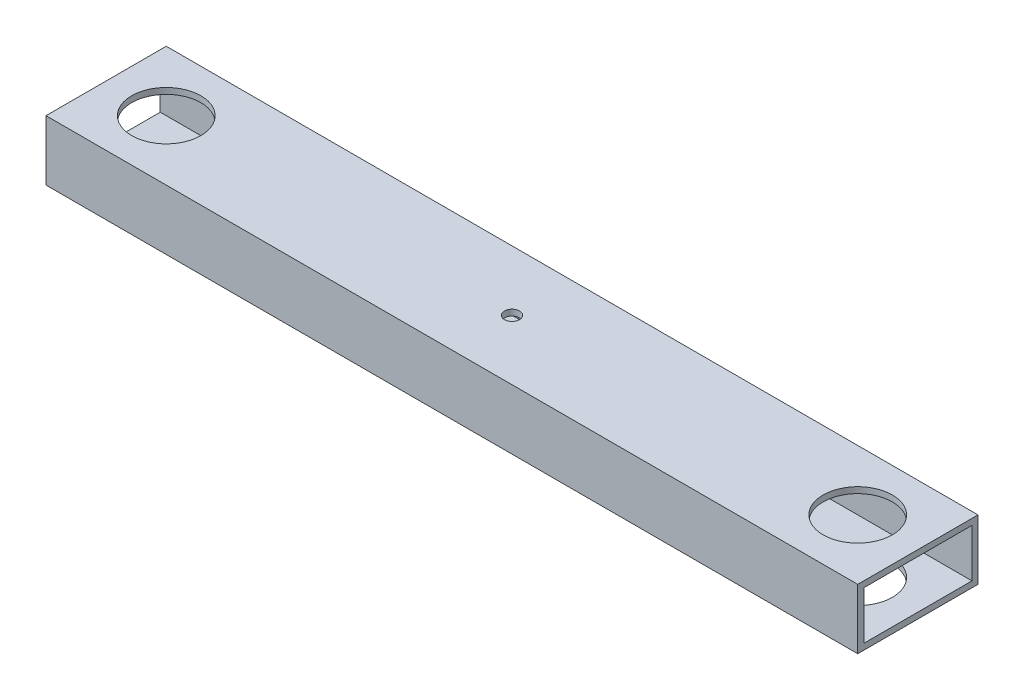
ISO-10303-21;
HEADER;
FILE_DESCRIPTION(('STEP AP214'),'2;1');
FILE_NAME('part.step','',(''),(''),'','','');
FILE_SCHEMA(('AUTOMOTIVE_DESIGN { 1 0 10303 214 1 1 1 1 }'));
ENDSEC;
DATA;
#1=APPLICATION_CONTEXT('core data for automotive mechanical design processes');
#2=APPLICATION_PROTOCOL_DEFINITION('international standard','automotive_design',2000,#1);
#3=PRODUCT_CONTEXT('',#1,'mechanical');
#4=PRODUCT('Part','Part','',(#3));
#5=PRODUCT_RELATED_PRODUCT_CATEGORY('part','',(#4));
#6=PRODUCT_DEFINITION_FORMATION('','',#4);
#7=PRODUCT_DEFINITION_CONTEXT('part definition',#1,'design');
#8=PRODUCT_DEFINITION('design','',#6,#7);
#9=PRODUCT_DEFINITION_SHAPE('','',#8);
#10=(LENGTH_UNIT() NAMED_UNIT(*) SI_UNIT(.MILLI.,.METRE.));
#11=(NAMED_UNIT(*) PLANE_ANGLE_UNIT() SI_UNIT($,.RADIAN.));
#12=(NAMED_UNIT(*) SI_UNIT($,.STERADIAN.) SOLID_ANGLE_UNIT());
#13=UNCERTAINTY_MEASURE_WITH_UNIT(LENGTH_MEASURE(1.E-05),#10,'distance_accuracy_value','');
#14=(GEOMETRIC_REPRESENTATION_CONTEXT(3) GLOBAL_UNCERTAINTY_ASSIGNED_CONTEXT((#13)) GLOBAL_UNIT_ASSIGNED_CONTEXT((#10,
#11,#12)) REPRESENTATION_CONTEXT('',''));
#15=CARTESIAN_POINT('',(0.,0.,0.));
#16=DIRECTION('',(0.,0.,1.));
#17=DIRECTION('',(1.,0.,0.));
#18=AXIS2_PLACEMENT_3D('',#15,#16,#17);
#19=CARTESIAN_POINT('',(342.9,0.,0.));
#20=DIRECTION('',(-1.,0.,0.));
#21=DIRECTION('',(0.,0.,1.));
#22=AXIS2_PLACEMENT_3D('',#19,#20,#21);
#23=PLANE('',#22);
#24=DIRECTION('',(0.,1.,0.));
#25=VECTOR('',#24,1.);
#26=CARTESIAN_POINT('',(342.9,-12.7,-25.4));
#27=LINE('',#26,#25);
#28=CARTESIAN_POINT('',(342.9,-12.7,-25.4));
#29=VERTEX_POINT('',#28);
#30=CARTESIAN_POINT('',(342.9,12.7,-25.4));
#31=VERTEX_POINT('',#30);
#32=EDGE_CURVE('E146',#29,#31,#27,.T.);
#33=ORIENTED_EDGE('',*,*,#32,.T.);
#34=DIRECTION('',(0.,0.,1.));
#35=VECTOR('',#34,1.);
#36=CARTESIAN_POINT('',(342.9,12.7,25.4));
#37=LINE('',#36,#35);
#38=CARTESIAN_POINT('',(342.9,12.7,25.4));
#39=VERTEX_POINT('',#38);
#40=EDGE_CURVE('E149',#31,#39,#37,.T.);
#41=ORIENTED_EDGE('',*,*,#40,.T.);
#42=DIRECTION('',(0.,-1.,0.));
#43=VECTOR('',#42,1.);
#44=CARTESIAN_POINT('',(342.9,-12.7,25.4));
#45=LINE('',#44,#43);
#46=CARTESIAN_POINT('',(342.9,-12.7,25.4));
#47=VERTEX_POINT('',#46);
#48=EDGE_CURVE('E152',#39,#47,#45,.T.);
#49=ORIENTED_EDGE('',*,*,#48,.T.);
#50=DIRECTION('',(0.,0.,-1.));
#51=VECTOR('',#50,1.);
#52=CARTESIAN_POINT('',(342.9,-12.7,25.4));
#53=LINE('',#52,#51);
#54=EDGE_CURVE('E154',#47,#29,#53,.T.);
#55=ORIENTED_EDGE('',*,*,#54,.T.);
#56=EDGE_LOOP('',(#33,#41,#49,#55));
#57=FACE_BOUND('',#56,.T.);
#58=DIRECTION('',(0.,-1.,0.));
#59=VECTOR('',#58,1.);
#60=CARTESIAN_POINT('',(342.9,-10.16,22.86));
#61=LINE('',#60,#59);
#62=CARTESIAN_POINT('',(342.9,10.16,22.86));
#63=VERTEX_POINT('',#62);
#64=CARTESIAN_POINT('',(342.9,-10.16,22.86));
#65=VERTEX_POINT('',#64);
#66=EDGE_CURVE('E108',#63,#65,#61,.T.);
#67=ORIENTED_EDGE('',*,*,#66,.F.);
#68=DIRECTION('',(0.,0.,1.));
#69=VECTOR('',#68,1.);
#70=CARTESIAN_POINT('',(342.9,10.16,22.86));
#71=LINE('',#70,#69);
#72=CARTESIAN_POINT('',(342.9,10.16,-22.86));
#73=VERTEX_POINT('',#72);
#74=EDGE_CURVE('E130',#73,#63,#71,.T.);
#75=ORIENTED_EDGE('',*,*,#74,.F.);
#76=DIRECTION('',(0.,1.,0.));
#77=VECTOR('',#76,1.);
#78=CARTESIAN_POINT('',(342.9,-10.16,-22.86));
#79=LINE('',#78,#77);
#80=CARTESIAN_POINT('',(342.9,-10.16,-22.86));
#81=VERTEX_POINT('',#80);
#82=EDGE_CURVE('E128',#81,#73,#79,.T.);
#83=ORIENTED_EDGE('',*,*,#82,.F.);
#84=DIRECTION('',(0.,0.,-1.));
#85=VECTOR('',#84,1.);
#86=CARTESIAN_POINT('',(342.9,-10.16,22.86));
#87=LINE('',#86,#85);
#88=EDGE_CURVE('E116',#65,#81,#87,.T.);
#89=ORIENTED_EDGE('',*,*,#88,.F.);
#90=EDGE_LOOP('',(#67,#75,#83,#89));
#91=FACE_BOUND('',#90,.T.);
#92=ADVANCED_FACE('F41',(#57,#91),#23,.F.);
#93=CARTESIAN_POINT('',(0.,0.,0.));
#94=DIRECTION('',(-1.,0.,0.));
#95=DIRECTION('',(0.,0.,1.));
#96=AXIS2_PLACEMENT_3D('',#93,#94,#95);
#97=PLANE('',#96);
#98=DIRECTION('',(0.,1.,0.));
#99=VECTOR('',#98,1.);
#100=CARTESIAN_POINT('',(0.,-12.7,-25.4));
#101=LINE('',#100,#99);
#102=CARTESIAN_POINT('',(0.,-12.7,-25.4));
#103=VERTEX_POINT('',#102);
#104=CARTESIAN_POINT('',(0.,12.7,-25.4));
#105=VERTEX_POINT('',#104);
#106=EDGE_CURVE('E124',#103,#105,#101,.T.);
#107=ORIENTED_EDGE('',*,*,#106,.F.);
#108=DIRECTION('',(0.,0.,-1.));
#109=VECTOR('',#108,1.);
#110=CARTESIAN_POINT('',(0.,-12.7,25.4));
#111=LINE('',#110,#109);
#112=CARTESIAN_POINT('',(0.,-12.7,25.4));
#113=VERTEX_POINT('',#112);
#114=EDGE_CURVE('E150',#113,#103,#111,.T.);
#115=ORIENTED_EDGE('',*,*,#114,.F.);
#116=DIRECTION('',(0.,-1.,0.));
#117=VECTOR('',#116,1.);
#118=CARTESIAN_POINT('',(0.,-12.7,25.4));
#119=LINE('',#118,#117);
#120=CARTESIAN_POINT('',(0.,12.7,25.4));
#121=VERTEX_POINT('',#120);
#122=EDGE_CURVE('E161',#121,#113,#119,.T.);
#123=ORIENTED_EDGE('',*,*,#122,.F.);
#124=DIRECTION('',(0.,0.,1.));
#125=VECTOR('',#124,1.);
#126=CARTESIAN_POINT('',(0.,12.7,25.4));
#127=LINE('',#126,#125);
#128=EDGE_CURVE('E159',#105,#121,#127,.T.);
#129=ORIENTED_EDGE('',*,*,#128,.F.);
#130=EDGE_LOOP('',(#107,#115,#123,#129));
#131=FACE_BOUND('',#130,.T.);
#132=DIRECTION('',(0.,0.,1.));
#133=VECTOR('',#132,1.);
#134=CARTESIAN_POINT('',(0.,10.16,22.86));
#135=LINE('',#134,#133);
#136=CARTESIAN_POINT('',(0.,10.16,-22.86));
#137=VERTEX_POINT('',#136);
#138=CARTESIAN_POINT('',(0.,10.16,22.86));
#139=VERTEX_POINT('',#138);
#140=EDGE_CURVE('E117',#137,#139,#135,.T.);
#141=ORIENTED_EDGE('',*,*,#140,.T.);
#142=DIRECTION('',(0.,-1.,0.));
#143=VECTOR('',#142,1.);
#144=CARTESIAN_POINT('',(0.,-10.16,22.86));
#145=LINE('',#144,#143);
#146=CARTESIAN_POINT('',(0.,-10.16,22.86));
#147=VERTEX_POINT('',#146);
#148=EDGE_CURVE('E66',#139,#147,#145,.T.);
#149=ORIENTED_EDGE('',*,*,#148,.T.);
#150=DIRECTION('',(0.,0.,-1.));
#151=VECTOR('',#150,1.);
#152=CARTESIAN_POINT('',(0.,-10.16,22.86));
#153=LINE('',#152,#151);
#154=CARTESIAN_POINT('',(0.,-10.16,-22.86));
#155=VERTEX_POINT('',#154);
#156=EDGE_CURVE('E123',#147,#155,#153,.T.);
#157=ORIENTED_EDGE('',*,*,#156,.T.);
#158=DIRECTION('',(0.,1.,0.));
#159=VECTOR('',#158,1.);
#160=CARTESIAN_POINT('',(0.,-10.16,-22.86));
#161=LINE('',#160,#159);
#162=EDGE_CURVE('E138',#155,#137,#161,.T.);
#163=ORIENTED_EDGE('',*,*,#162,.T.);
#164=EDGE_LOOP('',(#141,#149,#157,#163));
#165=FACE_BOUND('',#164,.T.);
#166=ADVANCED_FACE('F222',(#131,#165),#97,.T.);
#167=CARTESIAN_POINT('',(342.9,-12.7,-25.4));
#168=DIRECTION('',(0.,0.,1.));
#169=DIRECTION('',(1.,0.,0.));
#170=AXIS2_PLACEMENT_3D('',#167,#168,#169);
#171=PLANE('',#170);
#172=ORIENTED_EDGE('',*,*,#106,.T.);
#173=DIRECTION('',(-1.,0.,0.));
#174=VECTOR('',#173,1.);
#175=CARTESIAN_POINT('',(342.9,12.7,-25.4));
#176=LINE('',#175,#174);
#177=EDGE_CURVE('E11',#31,#105,#176,.T.);
#178=ORIENTED_EDGE('',*,*,#177,.F.);
#179=ORIENTED_EDGE('',*,*,#32,.F.);
#180=DIRECTION('',(-1.,0.,0.));
#181=VECTOR('',#180,1.);
#182=CARTESIAN_POINT('',(342.9,-12.7,-25.4));
#183=LINE('',#182,#181);
#184=EDGE_CURVE('E156',#29,#103,#183,.T.);
#185=ORIENTED_EDGE('',*,*,#184,.T.);
#186=EDGE_LOOP('',(#172,#178,#179,#185));
#187=FACE_BOUND('',#186,.T.);
#188=ADVANCED_FACE('F43',(#187),#171,.F.);
#189=CARTESIAN_POINT('',(342.9,12.7,25.4));
#190=DIRECTION('',(0.,-1.,0.));
#191=DIRECTION('',(0.,0.,-1.));
#192=AXIS2_PLACEMENT_3D('',#189,#190,#191);
#193=PLANE('',#192);
#194=CARTESIAN_POINT('',(171.45,12.7,0.));
#195=DIRECTION('',(0.,-1.,0.));
#196=DIRECTION('',(0.,0.,-1.));
#197=AXIS2_PLACEMENT_3D('',#194,#195,#196);
#198=CIRCLE('',#197,3.175);
#199=CARTESIAN_POINT('',(171.45,12.7,-3.17499999999999));
#200=VERTEX_POINT('',#199);
#201=EDGE_CURVE('E202',#200,#200,#198,.T.);
#202=ORIENTED_EDGE('',*,*,#201,.T.);
#203=EDGE_LOOP('',(#202));
#204=FACE_BOUND('',#203,.T.);
#205=CARTESIAN_POINT('',(25.4,12.7,0.));
#206=DIRECTION('',(0.,-1.,0.));
#207=DIRECTION('',(0.,0.,-1.));
#208=AXIS2_PLACEMENT_3D('',#205,#206,#207);
#209=CIRCLE('',#208,14.605);
#210=CARTESIAN_POINT('',(25.4,12.7,-14.605));
#211=VERTEX_POINT('',#210);
#212=EDGE_CURVE('E174',#211,#211,#209,.T.);
#213=ORIENTED_EDGE('',*,*,#212,.T.);
#214=EDGE_LOOP('',(#213));
#215=FACE_BOUND('',#214,.T.);
#216=CARTESIAN_POINT('',(317.5,12.7,0.));
#217=DIRECTION('',(0.,-1.,0.));
#218=DIRECTION('',(0.,0.,1.));
#219=AXIS2_PLACEMENT_3D('',#216,#217,#218);
#220=CIRCLE('',#219,14.605);
#221=CARTESIAN_POINT('',(317.5,12.7,14.605));
#222=VERTEX_POINT('',#221);
#223=EDGE_CURVE('E188',#222,#222,#220,.T.);
#224=ORIENTED_EDGE('',*,*,#223,.T.);
#225=EDGE_LOOP('',(#224));
#226=FACE_BOUND('',#225,.T.);
#227=ORIENTED_EDGE('',*,*,#128,.T.);
#228=DIRECTION('',(-1.,0.,0.));
#229=VECTOR('',#228,1.);
#230=CARTESIAN_POINT('',(342.9,12.7,25.4));
#231=LINE('',#230,#229);
#232=EDGE_CURVE('E50',#39,#121,#231,.T.);
#233=ORIENTED_EDGE('',*,*,#232,.F.);
#234=ORIENTED_EDGE('',*,*,#40,.F.);
#235=ORIENTED_EDGE('',*,*,#177,.T.);
#236=EDGE_LOOP('',(#227,#233,#234,#235));
#237=FACE_BOUND('',#236,.T.);
#238=ADVANCED_FACE('F247',(#204,#215,#226,#237),#193,.F.);
#239=CARTESIAN_POINT('',(342.9,-12.7,25.4));
#240=DIRECTION('',(0.,0.,-1.));
#241=DIRECTION('',(-1.,0.,0.));
#242=AXIS2_PLACEMENT_3D('',#239,#240,#241);
#243=PLANE('',#242);
#244=ORIENTED_EDGE('',*,*,#122,.T.);
#245=DIRECTION('',(-1.,0.,0.));
#246=VECTOR('',#245,1.);
#247=CARTESIAN_POINT('',(342.9,-12.7,25.4));
#248=LINE('',#247,#246);
#249=EDGE_CURVE('E166',#47,#113,#248,.T.);
#250=ORIENTED_EDGE('',*,*,#249,.F.);
#251=ORIENTED_EDGE('',*,*,#48,.F.);
#252=ORIENTED_EDGE('',*,*,#232,.T.);
#253=EDGE_LOOP('',(#244,#250,#251,#252));
#254=FACE_BOUND('',#253,.T.);
#255=ADVANCED_FACE('F244',(#254),#243,.F.);
#256=CARTESIAN_POINT('',(342.9,-12.7,25.4));
#257=DIRECTION('',(0.,1.,0.));
#258=DIRECTION('',(0.,0.,1.));
#259=AXIS2_PLACEMENT_3D('',#256,#257,#258);
#260=PLANE('',#259);
#261=CARTESIAN_POINT('',(171.45,-12.7,0.));
#262=DIRECTION('',(0.,-1.,0.));
#263=DIRECTION('',(0.,0.,-1.));
#264=AXIS2_PLACEMENT_3D('',#261,#262,#263);
#265=CIRCLE('',#264,3.175);
#266=CARTESIAN_POINT('',(171.45,-12.7,-3.17499999999999));
#267=VERTEX_POINT('',#266);
#268=EDGE_CURVE('E199',#267,#267,#265,.T.);
#269=ORIENTED_EDGE('',*,*,#268,.F.);
#270=EDGE_LOOP('',(#269));
#271=FACE_BOUND('',#270,.T.);
#272=CARTESIAN_POINT('',(25.4,-12.7,0.));
#273=DIRECTION('',(0.,-1.,0.));
#274=DIRECTION('',(0.,0.,-1.));
#275=AXIS2_PLACEMENT_3D('',#272,#273,#274);
#276=CIRCLE('',#275,14.605);
#277=CARTESIAN_POINT('',(25.4,-12.7,-14.605));
#278=VERTEX_POINT('',#277);
#279=EDGE_CURVE('E192',#278,#278,#276,.T.);
#280=ORIENTED_EDGE('',*,*,#279,.F.);
#281=EDGE_LOOP('',(#280));
#282=FACE_BOUND('',#281,.T.);
#283=CARTESIAN_POINT('',(317.5,-12.7,0.));
#284=DIRECTION('',(0.,-1.,0.));
#285=DIRECTION('',(0.,0.,1.));
#286=AXIS2_PLACEMENT_3D('',#283,#284,#285);
#287=CIRCLE('',#286,14.605);
#288=CARTESIAN_POINT('',(317.5,-12.7,14.605));
#289=VERTEX_POINT('',#288);
#290=EDGE_CURVE('E185',#289,#289,#287,.T.);
#291=ORIENTED_EDGE('',*,*,#290,.F.);
#292=EDGE_LOOP('',(#291));
#293=FACE_BOUND('',#292,.T.);
#294=ORIENTED_EDGE('',*,*,#114,.T.);
#295=ORIENTED_EDGE('',*,*,#184,.F.);
#296=ORIENTED_EDGE('',*,*,#54,.F.);
#297=ORIENTED_EDGE('',*,*,#249,.T.);
#298=EDGE_LOOP('',(#294,#295,#296,#297));
#299=FACE_BOUND('',#298,.T.);
#300=ADVANCED_FACE('F241',(#271,#282,#293,#299),#260,.F.);
#301=CARTESIAN_POINT('',(342.9,-10.16,22.86));
#302=DIRECTION('',(0.,0.,-1.));
#303=DIRECTION('',(-1.,0.,0.));
#304=AXIS2_PLACEMENT_3D('',#301,#302,#303);
#305=PLANE('',#304);
#306=ORIENTED_EDGE('',*,*,#148,.F.);
#307=DIRECTION('',(-1.,0.,0.));
#308=VECTOR('',#307,1.);
#309=CARTESIAN_POINT('',(342.9,10.16,22.86));
#310=LINE('',#309,#308);
#311=EDGE_CURVE('E112',#63,#139,#310,.T.);
#312=ORIENTED_EDGE('',*,*,#311,.F.);
#313=ORIENTED_EDGE('',*,*,#66,.T.);
#314=DIRECTION('',(-1.,0.,0.));
#315=VECTOR('',#314,1.);
#316=CARTESIAN_POINT('',(342.9,-10.16,22.86));
#317=LINE('',#316,#315);
#318=EDGE_CURVE('E111',#65,#147,#317,.T.);
#319=ORIENTED_EDGE('',*,*,#318,.T.);
#320=EDGE_LOOP('',(#306,#312,#313,#319));
#321=FACE_BOUND('',#320,.T.);
#322=ADVANCED_FACE('F110',(#321),#305,.T.);
#323=CARTESIAN_POINT('',(342.9,-10.16,22.86));
#324=DIRECTION('',(0.,1.,0.));
#325=DIRECTION('',(0.,0.,1.));
#326=AXIS2_PLACEMENT_3D('',#323,#324,#325);
#327=PLANE('',#326);
#328=CARTESIAN_POINT('',(171.45,-10.16,0.));
#329=DIRECTION('',(0.,1.,0.));
#330=DIRECTION('',(0.,0.,1.));
#331=AXIS2_PLACEMENT_3D('',#328,#329,#330);
#332=CIRCLE('',#331,3.175);
#333=CARTESIAN_POINT('',(171.45,-10.16,3.17500000000001));
#334=VERTEX_POINT('',#333);
#335=EDGE_CURVE('E189',#334,#334,#332,.T.);
#336=ORIENTED_EDGE('',*,*,#335,.F.);
#337=EDGE_LOOP('',(#336));
#338=FACE_BOUND('',#337,.T.);
#339=CARTESIAN_POINT('',(25.4,-10.16,0.));
#340=DIRECTION('',(0.,1.,0.));
#341=DIRECTION('',(0.,0.,1.));
#342=AXIS2_PLACEMENT_3D('',#339,#340,#341);
#343=CIRCLE('',#342,14.605);
#344=CARTESIAN_POINT('',(25.4,-10.16,14.605));
#345=VERTEX_POINT('',#344);
#346=EDGE_CURVE('E136',#345,#345,#343,.T.);
#347=ORIENTED_EDGE('',*,*,#346,.F.);
#348=EDGE_LOOP('',(#347));
#349=FACE_BOUND('',#348,.T.);
#350=CARTESIAN_POINT('',(317.5,-10.16,0.));
#351=DIRECTION('',(0.,1.,0.));
#352=DIRECTION('',(0.,0.,1.));
#353=AXIS2_PLACEMENT_3D('',#350,#351,#352);
#354=CIRCLE('',#353,14.605);
#355=CARTESIAN_POINT('',(317.5,-10.16,14.605));
#356=VERTEX_POINT('',#355);
#357=EDGE_CURVE('E173',#356,#356,#354,.T.);
#358=ORIENTED_EDGE('',*,*,#357,.F.);
#359=EDGE_LOOP('',(#358));
#360=FACE_BOUND('',#359,.T.);
#361=ORIENTED_EDGE('',*,*,#156,.F.);
#362=ORIENTED_EDGE('',*,*,#318,.F.);
#363=ORIENTED_EDGE('',*,*,#88,.T.);
#364=DIRECTION('',(-1.,0.,0.));
#365=VECTOR('',#364,1.);
#366=CARTESIAN_POINT('',(342.9,-10.16,-22.86));
#367=LINE('',#366,#365);
#368=EDGE_CURVE('E125',#81,#155,#367,.T.);
#369=ORIENTED_EDGE('',*,*,#368,.T.);
#370=EDGE_LOOP('',(#361,#362,#363,#369));
#371=FACE_BOUND('',#370,.T.);
#372=ADVANCED_FACE('F120',(#338,#349,#360,#371),#327,.T.);
#373=CARTESIAN_POINT('',(342.9,-10.16,-22.86));
#374=DIRECTION('',(0.,0.,1.));
#375=DIRECTION('',(1.,0.,0.));
#376=AXIS2_PLACEMENT_3D('',#373,#374,#375);
#377=PLANE('',#376);
#378=ORIENTED_EDGE('',*,*,#162,.F.);
#379=ORIENTED_EDGE('',*,*,#368,.F.);
#380=ORIENTED_EDGE('',*,*,#82,.T.);
#381=DIRECTION('',(-1.,0.,0.));
#382=VECTOR('',#381,1.);
#383=CARTESIAN_POINT('',(342.9,10.16,-22.86));
#384=LINE('',#383,#382);
#385=EDGE_CURVE('E58',#73,#137,#384,.T.);
#386=ORIENTED_EDGE('',*,*,#385,.T.);
#387=EDGE_LOOP('',(#378,#379,#380,#386));
#388=FACE_BOUND('',#387,.T.);
#389=ADVANCED_FACE('F216',(#388),#377,.T.);
#390=CARTESIAN_POINT('',(342.9,10.16,22.86));
#391=DIRECTION('',(0.,-1.,0.));
#392=DIRECTION('',(0.,0.,-1.));
#393=AXIS2_PLACEMENT_3D('',#390,#391,#392);
#394=PLANE('',#393);
#395=CARTESIAN_POINT('',(171.45,10.16,0.));
#396=DIRECTION('',(0.,-1.,0.));
#397=DIRECTION('',(0.,0.,-1.));
#398=AXIS2_PLACEMENT_3D('',#395,#396,#397);
#399=CIRCLE('',#398,3.175);
#400=CARTESIAN_POINT('',(171.45,10.16,-3.17499999999999));
#401=VERTEX_POINT('',#400);
#402=EDGE_CURVE('E45',#401,#401,#399,.T.);
#403=ORIENTED_EDGE('',*,*,#402,.F.);
#404=EDGE_LOOP('',(#403));
#405=FACE_BOUND('',#404,.T.);
#406=CARTESIAN_POINT('',(25.4,10.16,0.));
#407=DIRECTION('',(0.,-1.,0.));
#408=DIRECTION('',(0.,0.,-1.));
#409=AXIS2_PLACEMENT_3D('',#406,#407,#408);
#410=CIRCLE('',#409,14.605);
#411=CARTESIAN_POINT('',(25.4,10.16,-14.605));
#412=VERTEX_POINT('',#411);
#413=EDGE_CURVE('E175',#412,#412,#410,.T.);
#414=ORIENTED_EDGE('',*,*,#413,.F.);
#415=EDGE_LOOP('',(#414));
#416=FACE_BOUND('',#415,.T.);
#417=CARTESIAN_POINT('',(317.5,10.16,0.));
#418=DIRECTION('',(0.,-1.,0.));
#419=DIRECTION('',(0.,0.,-1.));
#420=AXIS2_PLACEMENT_3D('',#417,#418,#419);
#421=CIRCLE('',#420,14.605);
#422=CARTESIAN_POINT('',(317.5,10.16,-14.605));
#423=VERTEX_POINT('',#422);
#424=EDGE_CURVE('E171',#423,#423,#421,.T.);
#425=ORIENTED_EDGE('',*,*,#424,.F.);
#426=EDGE_LOOP('',(#425));
#427=FACE_BOUND('',#426,.T.);
#428=ORIENTED_EDGE('',*,*,#140,.F.);
#429=ORIENTED_EDGE('',*,*,#385,.F.);
#430=ORIENTED_EDGE('',*,*,#74,.T.);
#431=ORIENTED_EDGE('',*,*,#311,.T.);
#432=EDGE_LOOP('',(#428,#429,#430,#431));
#433=FACE_BOUND('',#432,.T.);
#434=ADVANCED_FACE('F212',(#405,#416,#427,#433),#394,.T.);
#435=CARTESIAN_POINT('',(317.5,12.7,0.));
#436=DIRECTION('',(0.,-1.,0.));
#437=DIRECTION('',(0.,0.,-1.));
#438=AXIS2_PLACEMENT_3D('',#435,#436,#437);
#439=CYLINDRICAL_SURFACE('',#438,14.605);
#440=ORIENTED_EDGE('',*,*,#424,.T.);
#441=EDGE_LOOP('',(#440));
#442=FACE_BOUND('',#441,.T.);
#443=ORIENTED_EDGE('',*,*,#223,.F.);
#444=EDGE_LOOP('',(#443));
#445=FACE_BOUND('',#444,.T.);
#446=ADVANCED_FACE('F215',(#442,#445),#439,.F.);
#447=CARTESIAN_POINT('',(25.4,12.7,0.));
#448=DIRECTION('',(0.,-1.,0.));
#449=DIRECTION('',(0.,0.,-1.));
#450=AXIS2_PLACEMENT_3D('',#447,#448,#449);
#451=CYLINDRICAL_SURFACE('',#450,14.605);
#452=ORIENTED_EDGE('',*,*,#413,.T.);
#453=EDGE_LOOP('',(#452));
#454=FACE_BOUND('',#453,.T.);
#455=ORIENTED_EDGE('',*,*,#212,.F.);
#456=EDGE_LOOP('',(#455));
#457=FACE_BOUND('',#456,.T.);
#458=ADVANCED_FACE('F272',(#454,#457),#451,.F.);
#459=ORIENTED_EDGE('',*,*,#357,.T.);
#460=EDGE_LOOP('',(#459));
#461=FACE_BOUND('',#460,.T.);
#462=ORIENTED_EDGE('',*,*,#290,.T.);
#463=EDGE_LOOP('',(#462));
#464=FACE_BOUND('',#463,.T.);
#465=ADVANCED_FACE('F275',(#461,#464),#439,.F.);
#466=ORIENTED_EDGE('',*,*,#346,.T.);
#467=EDGE_LOOP('',(#466));
#468=FACE_BOUND('',#467,.T.);
#469=ORIENTED_EDGE('',*,*,#279,.T.);
#470=EDGE_LOOP('',(#469));
#471=FACE_BOUND('',#470,.T.);
#472=ADVANCED_FACE('F280',(#468,#471),#451,.F.);
#473=CARTESIAN_POINT('',(171.45,12.7,0.));
#474=DIRECTION('',(0.,-1.,0.));
#475=DIRECTION('',(0.,0.,-1.));
#476=AXIS2_PLACEMENT_3D('',#473,#474,#475);
#477=CYLINDRICAL_SURFACE('',#476,3.175);
#478=ORIENTED_EDGE('',*,*,#402,.T.);
#479=EDGE_LOOP('',(#478));
#480=FACE_BOUND('',#479,.T.);
#481=ORIENTED_EDGE('',*,*,#201,.F.);
#482=EDGE_LOOP('',(#481));
#483=FACE_BOUND('',#482,.T.);
#484=ADVANCED_FACE('F209',(#480,#483),#477,.F.);
#485=ORIENTED_EDGE('',*,*,#335,.T.);
#486=EDGE_LOOP('',(#485));
#487=FACE_BOUND('',#486,.T.);
#488=ORIENTED_EDGE('',*,*,#268,.T.);
#489=EDGE_LOOP('',(#488));
#490=FACE_BOUND('',#489,.T.);
#491=ADVANCED_FACE('F292',(#487,#490),#477,.F.);
#492=CLOSED_SHELL('',(#92,#166,#188,#238,#255,#300,#322,#372,#389,#434,#446,#458,#465,#472,#484,#491));
#493=MANIFOLD_SOLID_BREP('B2',#492);
#494=ADVANCED_BREP_SHAPE_REPRESENTATION('',(#18,#493),#14);
#495=SHAPE_DEFINITION_REPRESENTATION(#9,#494);
ENDSEC;
END-ISO-10303-21;
